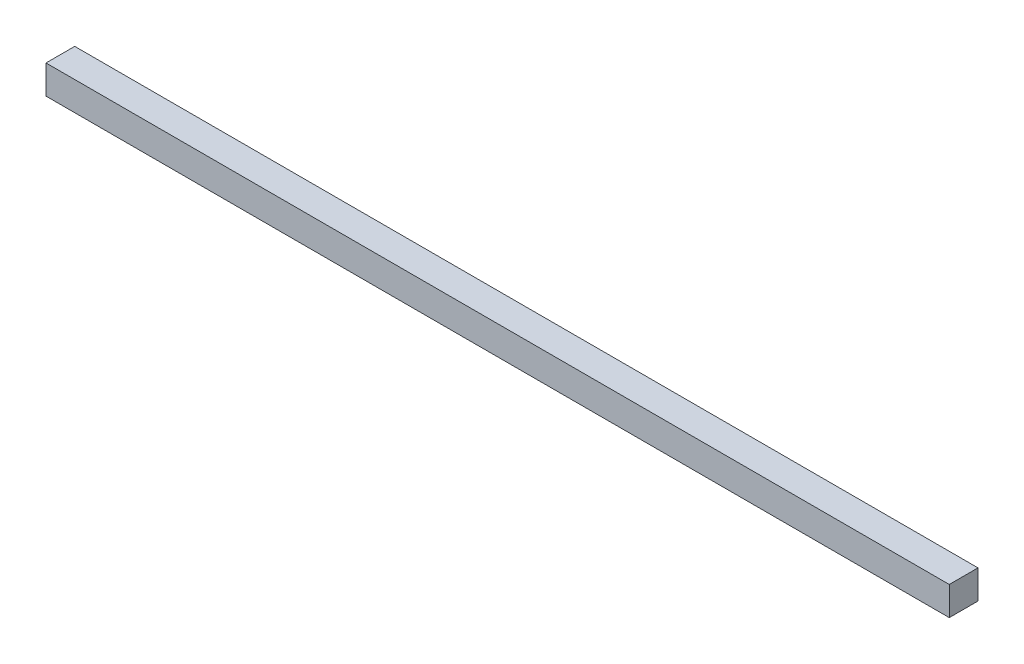
ISO-10303-21;
HEADER;
FILE_DESCRIPTION(('STEP AP214'),'2;1');
FILE_NAME('part.step','',(''),(''),'','','');
FILE_SCHEMA(('AUTOMOTIVE_DESIGN { 1 0 10303 214 1 1 1 1 }'));
ENDSEC;
DATA;
#1=APPLICATION_CONTEXT('core data for automotive mechanical design processes');
#2=APPLICATION_PROTOCOL_DEFINITION('international standard','automotive_design',2000,#1);
#3=PRODUCT_CONTEXT('',#1,'mechanical');
#4=PRODUCT('Part','Part','',(#3));
#5=PRODUCT_RELATED_PRODUCT_CATEGORY('part','',(#4));
#6=PRODUCT_DEFINITION_FORMATION('','',#4);
#7=PRODUCT_DEFINITION_CONTEXT('part definition',#1,'design');
#8=PRODUCT_DEFINITION('design','',#6,#7);
#9=PRODUCT_DEFINITION_SHAPE('','',#8);
#10=(LENGTH_UNIT() NAMED_UNIT(*) SI_UNIT(.MILLI.,.METRE.));
#11=(NAMED_UNIT(*) PLANE_ANGLE_UNIT() SI_UNIT($,.RADIAN.));
#12=(NAMED_UNIT(*) SI_UNIT($,.STERADIAN.) SOLID_ANGLE_UNIT());
#13=UNCERTAINTY_MEASURE_WITH_UNIT(LENGTH_MEASURE(1.E-05),#10,'distance_accuracy_value','');
#14=(GEOMETRIC_REPRESENTATION_CONTEXT(3) GLOBAL_UNCERTAINTY_ASSIGNED_CONTEXT((#13)) GLOBAL_UNIT_ASSIGNED_CONTEXT((#10,
#11,#12)) REPRESENTATION_CONTEXT('',''));
#15=CARTESIAN_POINT('',(0.,0.,0.));
#16=DIRECTION('',(0.,0.,1.));
#17=DIRECTION('',(1.,0.,0.));
#18=AXIS2_PLACEMENT_3D('',#15,#16,#17);
#19=CARTESIAN_POINT('',(0.,70.,70.));
#20=DIRECTION('',(1.,0.,0.));
#21=DIRECTION('',(0.,1.,0.));
#22=AXIS2_PLACEMENT_3D('',#19,#20,#21);
#23=PLANE('',#22);
#24=DIRECTION('',(0.,-1.,0.));
#25=VECTOR('',#24,1.);
#26=CARTESIAN_POINT('',(0.,70.,0.));
#27=LINE('',#26,#25);
#28=CARTESIAN_POINT('',(0.,70.,0.));
#29=VERTEX_POINT('',#28);
#30=CARTESIAN_POINT('',(0.,0.,0.));
#31=VERTEX_POINT('',#30);
#32=EDGE_CURVE('E97',#29,#31,#27,.T.);
#33=ORIENTED_EDGE('',*,*,#32,.T.);
#34=DIRECTION('',(0.,0.,-1.));
#35=VECTOR('',#34,1.);
#36=CARTESIAN_POINT('',(0.,0.,70.));
#37=LINE('',#36,#35);
#38=CARTESIAN_POINT('',(0.,0.,70.));
#39=VERTEX_POINT('',#38);
#40=EDGE_CURVE('E11',#39,#31,#37,.T.);
#41=ORIENTED_EDGE('',*,*,#40,.F.);
#42=DIRECTION('',(0.,-1.,0.));
#43=VECTOR('',#42,1.);
#44=CARTESIAN_POINT('',(0.,70.,70.));
#45=LINE('',#44,#43);
#46=CARTESIAN_POINT('',(0.,70.,70.));
#47=VERTEX_POINT('',#46);
#48=EDGE_CURVE('E85',#47,#39,#45,.T.);
#49=ORIENTED_EDGE('',*,*,#48,.F.);
#50=DIRECTION('',(0.,0.,-1.));
#51=VECTOR('',#50,1.);
#52=CARTESIAN_POINT('',(0.,70.,70.));
#53=LINE('',#52,#51);
#54=EDGE_CURVE('E93',#47,#29,#53,.T.);
#55=ORIENTED_EDGE('',*,*,#54,.T.);
#56=EDGE_LOOP('',(#33,#41,#49,#55));
#57=FACE_BOUND('',#56,.T.);
#58=ADVANCED_FACE('F34',(#57),#23,.F.);
#59=CARTESIAN_POINT('',(0.,0.,70.));
#60=DIRECTION('',(0.,1.,0.));
#61=DIRECTION('',(0.,0.,1.));
#62=AXIS2_PLACEMENT_3D('',#59,#60,#61);
#63=PLANE('',#62);
#64=DIRECTION('',(1.,0.,0.));
#65=VECTOR('',#64,1.);
#66=CARTESIAN_POINT('',(0.,0.,0.));
#67=LINE('',#66,#65);
#68=CARTESIAN_POINT('',(2200.,0.,0.));
#69=VERTEX_POINT('',#68);
#70=EDGE_CURVE('E89',#31,#69,#67,.T.);
#71=ORIENTED_EDGE('',*,*,#70,.T.);
#72=DIRECTION('',(0.,0.,-1.));
#73=VECTOR('',#72,1.);
#74=CARTESIAN_POINT('',(2200.,0.,70.));
#75=LINE('',#74,#73);
#76=CARTESIAN_POINT('',(2200.,0.,70.));
#77=VERTEX_POINT('',#76);
#78=EDGE_CURVE('E42',#77,#69,#75,.T.);
#79=ORIENTED_EDGE('',*,*,#78,.F.);
#80=DIRECTION('',(1.,0.,0.));
#81=VECTOR('',#80,1.);
#82=CARTESIAN_POINT('',(0.,0.,70.));
#83=LINE('',#82,#81);
#84=EDGE_CURVE('E80',#39,#77,#83,.T.);
#85=ORIENTED_EDGE('',*,*,#84,.F.);
#86=ORIENTED_EDGE('',*,*,#40,.T.);
#87=EDGE_LOOP('',(#71,#79,#85,#86));
#88=FACE_BOUND('',#87,.T.);
#89=ADVANCED_FACE('F88',(#88),#63,.F.);
#90=CARTESIAN_POINT('',(2200.,70.,70.));
#91=DIRECTION('',(-1.,0.,0.));
#92=DIRECTION('',(0.,0.,1.));
#93=AXIS2_PLACEMENT_3D('',#90,#91,#92);
#94=PLANE('',#93);
#95=DIRECTION('',(0.,1.,0.));
#96=VECTOR('',#95,1.);
#97=CARTESIAN_POINT('',(2200.,70.,0.));
#98=LINE('',#97,#96);
#99=CARTESIAN_POINT('',(2200.,70.,0.));
#100=VERTEX_POINT('',#99);
#101=EDGE_CURVE('E67',#69,#100,#98,.T.);
#102=ORIENTED_EDGE('',*,*,#101,.T.);
#103=DIRECTION('',(0.,0.,-1.));
#104=VECTOR('',#103,1.);
#105=CARTESIAN_POINT('',(2200.,70.,70.));
#106=LINE('',#105,#104);
#107=CARTESIAN_POINT('',(2200.,70.,70.));
#108=VERTEX_POINT('',#107);
#109=EDGE_CURVE('E90',#108,#100,#106,.T.);
#110=ORIENTED_EDGE('',*,*,#109,.F.);
#111=DIRECTION('',(0.,1.,0.));
#112=VECTOR('',#111,1.);
#113=CARTESIAN_POINT('',(2200.,70.,70.));
#114=LINE('',#113,#112);
#115=EDGE_CURVE('E83',#77,#108,#114,.T.);
#116=ORIENTED_EDGE('',*,*,#115,.F.);
#117=ORIENTED_EDGE('',*,*,#78,.T.);
#118=EDGE_LOOP('',(#102,#110,#116,#117));
#119=FACE_BOUND('',#118,.T.);
#120=ADVANCED_FACE('F91',(#119),#94,.F.);
#121=CARTESIAN_POINT('',(0.,70.,70.));
#122=DIRECTION('',(0.,-1.,0.));
#123=DIRECTION('',(0.,0.,-1.));
#124=AXIS2_PLACEMENT_3D('',#121,#122,#123);
#125=PLANE('',#124);
#126=DIRECTION('',(-1.,0.,0.));
#127=VECTOR('',#126,1.);
#128=CARTESIAN_POINT('',(0.,70.,0.));
#129=LINE('',#128,#127);
#130=EDGE_CURVE('E73',#100,#29,#129,.T.);
#131=ORIENTED_EDGE('',*,*,#130,.T.);
#132=ORIENTED_EDGE('',*,*,#54,.F.);
#133=DIRECTION('',(-1.,0.,0.));
#134=VECTOR('',#133,1.);
#135=CARTESIAN_POINT('',(0.,70.,70.));
#136=LINE('',#135,#134);
#137=EDGE_CURVE('E50',#108,#47,#136,.T.);
#138=ORIENTED_EDGE('',*,*,#137,.F.);
#139=ORIENTED_EDGE('',*,*,#109,.T.);
#140=EDGE_LOOP('',(#131,#132,#138,#139));
#141=FACE_BOUND('',#140,.T.);
#142=ADVANCED_FACE('F104',(#141),#125,.F.);
#143=CARTESIAN_POINT('',(0.,0.,70.));
#144=DIRECTION('',(0.,0.,1.));
#145=DIRECTION('',(1.,0.,0.));
#146=AXIS2_PLACEMENT_3D('',#143,#144,#145);
#147=PLANE('',#146);
#148=ORIENTED_EDGE('',*,*,#48,.T.);
#149=ORIENTED_EDGE('',*,*,#84,.T.);
#150=ORIENTED_EDGE('',*,*,#115,.T.);
#151=ORIENTED_EDGE('',*,*,#137,.T.);
#152=EDGE_LOOP('',(#148,#149,#150,#151));
#153=FACE_BOUND('',#152,.T.);
#154=ADVANCED_FACE('F81',(#153),#147,.T.);
#155=CARTESIAN_POINT('',(0.,0.,0.));
#156=DIRECTION('',(0.,0.,1.));
#157=DIRECTION('',(1.,0.,0.));
#158=AXIS2_PLACEMENT_3D('',#155,#156,#157);
#159=PLANE('',#158);
#160=ORIENTED_EDGE('',*,*,#32,.F.);
#161=ORIENTED_EDGE('',*,*,#130,.F.);
#162=ORIENTED_EDGE('',*,*,#101,.F.);
#163=ORIENTED_EDGE('',*,*,#70,.F.);
#164=EDGE_LOOP('',(#160,#161,#162,#163));
#165=FACE_BOUND('',#164,.T.);
#166=ADVANCED_FACE('F107',(#165),#159,.F.);
#167=CLOSED_SHELL('',(#58,#89,#120,#142,#154,#166));
#168=MANIFOLD_SOLID_BREP('B2',#167);
#169=ADVANCED_BREP_SHAPE_REPRESENTATION('',(#18,#168),#14);
#170=SHAPE_DEFINITION_REPRESENTATION(#9,#169);
ENDSEC;
END-ISO-10303-21;
